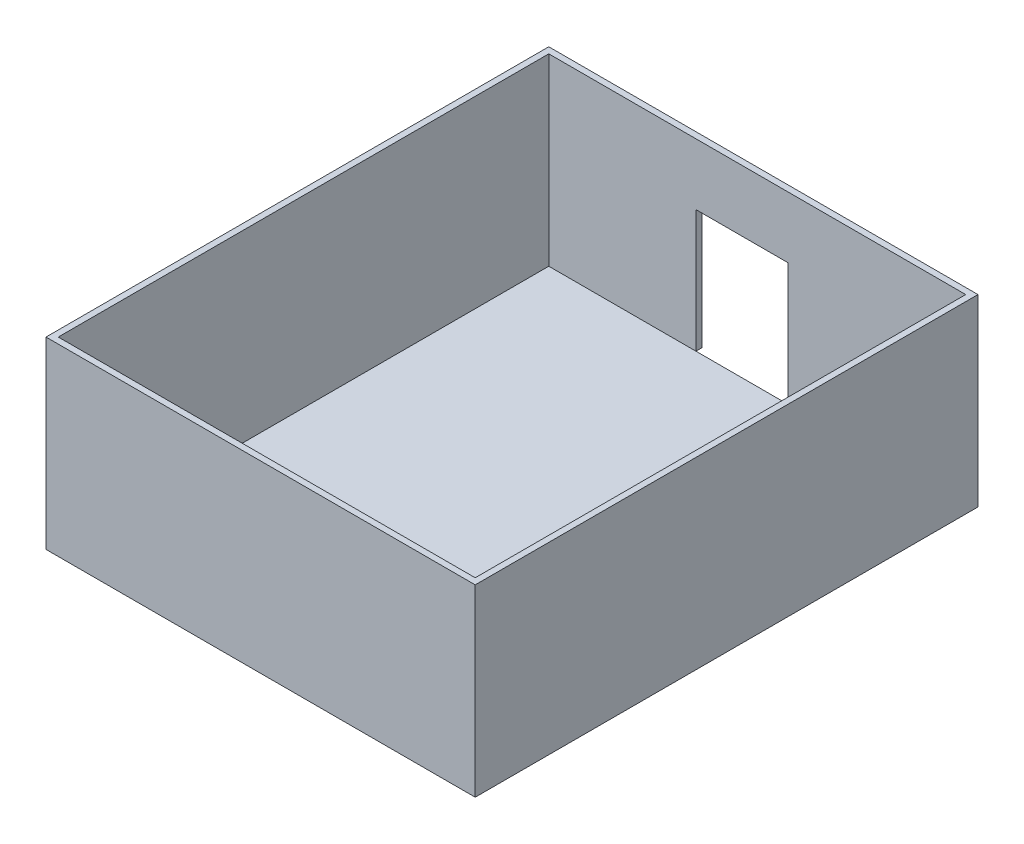
ISO-10303-21;
HEADER;
FILE_DESCRIPTION(('STEP AP214'),'2;1');
FILE_NAME('part.step','',(''),(''),'','','');
FILE_SCHEMA(('AUTOMOTIVE_DESIGN { 1 0 10303 214 1 1 1 1 }'));
ENDSEC;
DATA;
#1=APPLICATION_CONTEXT('core data for automotive mechanical design processes');
#2=APPLICATION_PROTOCOL_DEFINITION('international standard','automotive_design',2000,#1);
#3=PRODUCT_CONTEXT('',#1,'mechanical');
#4=PRODUCT('Part','Part','',(#3));
#5=PRODUCT_RELATED_PRODUCT_CATEGORY('part','',(#4));
#6=PRODUCT_DEFINITION_FORMATION('','',#4);
#7=PRODUCT_DEFINITION_CONTEXT('part definition',#1,'design');
#8=PRODUCT_DEFINITION('design','',#6,#7);
#9=PRODUCT_DEFINITION_SHAPE('','',#8);
#10=(LENGTH_UNIT() NAMED_UNIT(*) SI_UNIT(.MILLI.,.METRE.));
#11=(NAMED_UNIT(*) PLANE_ANGLE_UNIT() SI_UNIT($,.RADIAN.));
#12=(NAMED_UNIT(*) SI_UNIT($,.STERADIAN.) SOLID_ANGLE_UNIT());
#13=UNCERTAINTY_MEASURE_WITH_UNIT(LENGTH_MEASURE(1.E-05),#10,'distance_accuracy_value','');
#14=(GEOMETRIC_REPRESENTATION_CONTEXT(3) GLOBAL_UNCERTAINTY_ASSIGNED_CONTEXT((#13)) GLOBAL_UNIT_ASSIGNED_CONTEXT((#10,
#11,#12)) REPRESENTATION_CONTEXT('',''));
#15=CARTESIAN_POINT('',(0.,0.,0.));
#16=DIRECTION('',(0.,0.,1.));
#17=DIRECTION('',(1.,0.,0.));
#18=AXIS2_PLACEMENT_3D('',#15,#16,#17);
#19=CARTESIAN_POINT('',(0.,3010.,0.));
#20=DIRECTION('',(0.,1.,0.));
#21=DIRECTION('',(0.,0.,1.));
#22=AXIS2_PLACEMENT_3D('',#19,#20,#21);
#23=PLANE('',#22);
#24=DIRECTION('',(1.,0.,0.));
#25=VECTOR('',#24,1.);
#26=CARTESIAN_POINT('',(-6900.,3010.,99.9999999999999));
#27=LINE('',#26,#25);
#28=CARTESIAN_POINT('',(-6900.,3010.,99.9999999999999));
#29=VERTEX_POINT('',#28);
#30=CARTESIAN_POINT('',(100.,3010.,100.));
#31=VERTEX_POINT('',#30);
#32=EDGE_CURVE('E295',#29,#31,#27,.T.);
#33=ORIENTED_EDGE('',*,*,#32,.T.);
#34=DIRECTION('',(0.,0.,-1.));
#35=VECTOR('',#34,1.);
#36=CARTESIAN_POINT('',(100.,3010.,100.));
#37=LINE('',#36,#35);
#38=CARTESIAN_POINT('',(100.,3010.,-8100.));
#39=VERTEX_POINT('',#38);
#40=EDGE_CURVE('E299',#31,#39,#37,.T.);
#41=ORIENTED_EDGE('',*,*,#40,.T.);
#42=DIRECTION('',(-1.,0.,0.));
#43=VECTOR('',#42,1.);
#44=CARTESIAN_POINT('',(100.,3010.,-8100.));
#45=LINE('',#44,#43);
#46=CARTESIAN_POINT('',(-6900.,3010.,-8100.));
#47=VERTEX_POINT('',#46);
#48=EDGE_CURVE('E303',#39,#47,#45,.T.);
#49=ORIENTED_EDGE('',*,*,#48,.T.);
#50=DIRECTION('',(0.,0.,1.));
#51=VECTOR('',#50,1.);
#52=CARTESIAN_POINT('',(-6900.,3010.,-8100.));
#53=LINE('',#52,#51);
#54=EDGE_CURVE('E306',#47,#29,#53,.T.);
#55=ORIENTED_EDGE('',*,*,#54,.T.);
#56=EDGE_LOOP('',(#33,#41,#49,#55));
#57=FACE_BOUND('',#56,.T.);
#58=DIRECTION('',(0.,0.,-1.));
#59=VECTOR('',#58,1.);
#60=CARTESIAN_POINT('',(0.,3010.,0.));
#61=LINE('',#60,#59);
#62=CARTESIAN_POINT('',(0.,3010.,0.));
#63=VERTEX_POINT('',#62);
#64=CARTESIAN_POINT('',(3.90278794648645E-13,3010.,-8000.));
#65=VERTEX_POINT('',#64);
#66=EDGE_CURVE('E251',#63,#65,#61,.T.);
#67=ORIENTED_EDGE('',*,*,#66,.F.);
#68=DIRECTION('',(1.,0.,0.));
#69=VECTOR('',#68,1.);
#70=CARTESIAN_POINT('',(-6800.,3010.,9.79717439317883E-13));
#71=LINE('',#70,#69);
#72=CARTESIAN_POINT('',(-6800.,3010.,9.79717439317883E-13));
#73=VERTEX_POINT('',#72);
#74=EDGE_CURVE('E248',#73,#63,#71,.T.);
#75=ORIENTED_EDGE('',*,*,#74,.F.);
#76=DIRECTION('',(0.,0.,1.));
#77=VECTOR('',#76,1.);
#78=CARTESIAN_POINT('',(-6800.,3010.,-8000.));
#79=LINE('',#78,#77);
#80=CARTESIAN_POINT('',(-6800.,3010.,-8000.));
#81=VERTEX_POINT('',#80);
#82=EDGE_CURVE('E259',#81,#73,#79,.T.);
#83=ORIENTED_EDGE('',*,*,#82,.F.);
#84=DIRECTION('',(-1.,0.,0.));
#85=VECTOR('',#84,1.);
#86=CARTESIAN_POINT('',(3.90278794648645E-13,3010.,-8000.));
#87=LINE('',#86,#85);
#88=EDGE_CURVE('E255',#65,#81,#87,.T.);
#89=ORIENTED_EDGE('',*,*,#88,.F.);
#90=EDGE_LOOP('',(#67,#75,#83,#89));
#91=FACE_BOUND('',#90,.T.);
#92=ADVANCED_FACE('F53',(#57,#91),#23,.T.);
#93=CARTESIAN_POINT('',(0.,10.,0.));
#94=DIRECTION('',(0.,1.,0.));
#95=DIRECTION('',(0.,0.,1.));
#96=AXIS2_PLACEMENT_3D('',#93,#94,#95);
#97=PLANE('',#96);
#98=DIRECTION('',(0.,0.,-1.));
#99=VECTOR('',#98,1.);
#100=CARTESIAN_POINT('',(0.,10.,0.));
#101=LINE('',#100,#99);
#102=CARTESIAN_POINT('',(0.,10.,0.));
#103=VERTEX_POINT('',#102);
#104=CARTESIAN_POINT('',(0.,10.,-1400.));
#105=VERTEX_POINT('',#104);
#106=EDGE_CURVE('E267',#103,#105,#101,.T.);
#107=ORIENTED_EDGE('',*,*,#106,.T.);
#108=DIRECTION('',(-1.,0.,0.));
#109=VECTOR('',#108,1.);
#110=CARTESIAN_POINT('',(10.0000000000001,10.,-1400.));
#111=LINE('',#110,#109);
#112=CARTESIAN_POINT('',(10.0000000000001,10.,-1400.));
#113=VERTEX_POINT('',#112);
#114=EDGE_CURVE('E204',#113,#105,#111,.T.);
#115=ORIENTED_EDGE('',*,*,#114,.F.);
#116=DIRECTION('',(0.,0.,1.));
#117=VECTOR('',#116,1.);
#118=CARTESIAN_POINT('',(10.0000000000001,10.,-1400.));
#119=LINE('',#118,#117);
#120=CARTESIAN_POINT('',(10.0000000000001,9.9999999999999,-2200.));
#121=VERTEX_POINT('',#120);
#122=EDGE_CURVE('E175',#121,#113,#119,.T.);
#123=ORIENTED_EDGE('',*,*,#122,.F.);
#124=DIRECTION('',(-1.,0.,0.));
#125=VECTOR('',#124,1.);
#126=CARTESIAN_POINT('',(10.0000000000001,9.9999999999999,-2200.));
#127=LINE('',#126,#125);
#128=CARTESIAN_POINT('',(1.07326668528377E-13,9.9999999999999,-2200.));
#129=VERTEX_POINT('',#128);
#130=EDGE_CURVE('E208',#121,#129,#127,.T.);
#131=ORIENTED_EDGE('',*,*,#130,.T.);
#132=CARTESIAN_POINT('',(3.90278794648645E-13,10.,-8000.));
#133=VERTEX_POINT('',#132);
#134=EDGE_CURVE('E266',#129,#133,#101,.T.);
#135=ORIENTED_EDGE('',*,*,#134,.T.);
#136=DIRECTION('',(-1.,0.,0.));
#137=VECTOR('',#136,1.);
#138=CARTESIAN_POINT('',(3.90278794648645E-13,10.,-8000.));
#139=LINE('',#138,#137);
#140=CARTESIAN_POINT('',(-2900.,10.0000000000001,-8000.));
#141=VERTEX_POINT('',#140);
#142=EDGE_CURVE('E272',#133,#141,#139,.T.);
#143=ORIENTED_EDGE('',*,*,#142,.T.);
#144=DIRECTION('',(0.,0.,-1.));
#145=VECTOR('',#144,1.);
#146=CARTESIAN_POINT('',(-2900.,10.0000000000001,-8000.));
#147=LINE('',#146,#145);
#148=CARTESIAN_POINT('',(-2900.,10.0000000000001,-8100.));
#149=VERTEX_POINT('',#148);
#150=EDGE_CURVE('E239',#141,#149,#147,.T.);
#151=ORIENTED_EDGE('',*,*,#150,.T.);
#152=DIRECTION('',(-1.,0.,0.));
#153=VECTOR('',#152,1.);
#154=CARTESIAN_POINT('',(100.,10.,-8100.));
#155=LINE('',#154,#153);
#156=CARTESIAN_POINT('',(100.,10.,-8100.));
#157=VERTEX_POINT('',#156);
#158=EDGE_CURVE('E317',#157,#149,#155,.T.);
#159=ORIENTED_EDGE('',*,*,#158,.F.);
#160=DIRECTION('',(0.,0.,-1.));
#161=VECTOR('',#160,1.);
#162=CARTESIAN_POINT('',(100.,10.,100.));
#163=LINE('',#162,#161);
#164=CARTESIAN_POINT('',(100.,10.,100.));
#165=VERTEX_POINT('',#164);
#166=EDGE_CURVE('E313',#165,#157,#163,.T.);
#167=ORIENTED_EDGE('',*,*,#166,.F.);
#168=DIRECTION('',(1.,0.,0.));
#169=VECTOR('',#168,1.);
#170=CARTESIAN_POINT('',(-6900.,10.,99.9999999999999));
#171=LINE('',#170,#169);
#172=CARTESIAN_POINT('',(-6900.,10.,99.9999999999999));
#173=VERTEX_POINT('',#172);
#174=EDGE_CURVE('E294',#173,#165,#171,.T.);
#175=ORIENTED_EDGE('',*,*,#174,.F.);
#176=DIRECTION('',(0.,0.,1.));
#177=VECTOR('',#176,1.);
#178=CARTESIAN_POINT('',(-6900.,10.,-8100.));
#179=LINE('',#178,#177);
#180=CARTESIAN_POINT('',(-6900.,10.,-8100.));
#181=VERTEX_POINT('',#180);
#182=EDGE_CURVE('E300',#181,#173,#179,.T.);
#183=ORIENTED_EDGE('',*,*,#182,.F.);
#184=CARTESIAN_POINT('',(-4400.,10.,-8100.));
#185=VERTEX_POINT('',#184);
#186=EDGE_CURVE('E316',#185,#181,#155,.T.);
#187=ORIENTED_EDGE('',*,*,#186,.F.);
#188=DIRECTION('',(0.,0.,-1.));
#189=VECTOR('',#188,1.);
#190=CARTESIAN_POINT('',(-4400.,10.,-8000.));
#191=LINE('',#190,#189);
#192=CARTESIAN_POINT('',(-4400.,10.,-8000.));
#193=VERTEX_POINT('',#192);
#194=EDGE_CURVE('E235',#193,#185,#191,.T.);
#195=ORIENTED_EDGE('',*,*,#194,.F.);
#196=CARTESIAN_POINT('',(-6800.,10.,-8000.));
#197=VERTEX_POINT('',#196);
#198=EDGE_CURVE('E271',#193,#197,#139,.T.);
#199=ORIENTED_EDGE('',*,*,#198,.T.);
#200=DIRECTION('',(0.,0.,1.));
#201=VECTOR('',#200,1.);
#202=CARTESIAN_POINT('',(-6800.,10.,-8000.));
#203=LINE('',#202,#201);
#204=CARTESIAN_POINT('',(-6800.,10.,9.79717443686954E-13));
#205=VERTEX_POINT('',#204);
#206=EDGE_CURVE('E252',#197,#205,#203,.T.);
#207=ORIENTED_EDGE('',*,*,#206,.T.);
#208=DIRECTION('',(1.,0.,0.));
#209=VECTOR('',#208,1.);
#210=CARTESIAN_POINT('',(-6800.,10.,9.79717439317883E-13));
#211=LINE('',#210,#209);
#212=EDGE_CURVE('E238',#205,#103,#211,.T.);
#213=ORIENTED_EDGE('',*,*,#212,.T.);
#214=EDGE_LOOP('',(#107,#115,#123,#131,#135,#143,#151,#159,#167,#175,#183,#187,#195,#199,#207,#213));
#215=FACE_BOUND('',#214,.T.);
#216=ADVANCED_FACE('F341',(#215),#97,.F.);
#217=CARTESIAN_POINT('',(-6900.,3010.,99.9999999999999));
#218=DIRECTION('',(0.,0.,-1.));
#219=DIRECTION('',(-1.,0.,0.));
#220=AXIS2_PLACEMENT_3D('',#217,#218,#219);
#221=PLANE('',#220);
#222=ORIENTED_EDGE('',*,*,#174,.T.);
#223=DIRECTION('',(0.,-1.,0.));
#224=VECTOR('',#223,1.);
#225=CARTESIAN_POINT('',(100.,3010.,100.));
#226=LINE('',#225,#224);
#227=EDGE_CURVE('E12',#31,#165,#226,.T.);
#228=ORIENTED_EDGE('',*,*,#227,.F.);
#229=ORIENTED_EDGE('',*,*,#32,.F.);
#230=DIRECTION('',(0.,-1.,0.));
#231=VECTOR('',#230,1.);
#232=CARTESIAN_POINT('',(-6900.,3010.,99.9999999999999));
#233=LINE('',#232,#231);
#234=EDGE_CURVE('E309',#29,#173,#233,.T.);
#235=ORIENTED_EDGE('',*,*,#234,.T.);
#236=EDGE_LOOP('',(#222,#228,#229,#235));
#237=FACE_BOUND('',#236,.T.);
#238=ADVANCED_FACE('F55',(#237),#221,.F.);
#239=CARTESIAN_POINT('',(100.,3010.,100.));
#240=DIRECTION('',(-1.,0.,0.));
#241=DIRECTION('',(0.,0.,1.));
#242=AXIS2_PLACEMENT_3D('',#239,#240,#241);
#243=PLANE('',#242);
#244=ORIENTED_EDGE('',*,*,#166,.T.);
#245=DIRECTION('',(0.,-1.,0.));
#246=VECTOR('',#245,1.);
#247=CARTESIAN_POINT('',(100.,3010.,-8100.));
#248=LINE('',#247,#246);
#249=EDGE_CURVE('E62',#39,#157,#248,.T.);
#250=ORIENTED_EDGE('',*,*,#249,.F.);
#251=ORIENTED_EDGE('',*,*,#40,.F.);
#252=ORIENTED_EDGE('',*,*,#227,.T.);
#253=EDGE_LOOP('',(#244,#250,#251,#252));
#254=FACE_BOUND('',#253,.T.);
#255=ADVANCED_FACE('F402',(#254),#243,.F.);
#256=CARTESIAN_POINT('',(100.,3010.,-8100.));
#257=DIRECTION('',(0.,0.,1.));
#258=DIRECTION('',(1.,0.,0.));
#259=AXIS2_PLACEMENT_3D('',#256,#257,#258);
#260=PLANE('',#259);
#261=DIRECTION('',(1.,0.,0.));
#262=VECTOR('',#261,1.);
#263=CARTESIAN_POINT('',(-4400.,2010.,-8100.));
#264=LINE('',#263,#262);
#265=CARTESIAN_POINT('',(-4400.,2010.,-8100.));
#266=VERTEX_POINT('',#265);
#267=CARTESIAN_POINT('',(-2900.,2010.,-8100.));
#268=VERTEX_POINT('',#267);
#269=EDGE_CURVE('E229',#266,#268,#264,.T.);
#270=ORIENTED_EDGE('',*,*,#269,.F.);
#271=DIRECTION('',(0.,1.,0.));
#272=VECTOR('',#271,1.);
#273=CARTESIAN_POINT('',(-4400.,10.,-8100.));
#274=LINE('',#273,#272);
#275=EDGE_CURVE('E207',#185,#266,#274,.T.);
#276=ORIENTED_EDGE('',*,*,#275,.F.);
#277=ORIENTED_EDGE('',*,*,#186,.T.);
#278=DIRECTION('',(0.,-1.,0.));
#279=VECTOR('',#278,1.);
#280=CARTESIAN_POINT('',(-6900.,3010.,-8100.));
#281=LINE('',#280,#279);
#282=EDGE_CURVE('E326',#47,#181,#281,.T.);
#283=ORIENTED_EDGE('',*,*,#282,.F.);
#284=ORIENTED_EDGE('',*,*,#48,.F.);
#285=ORIENTED_EDGE('',*,*,#249,.T.);
#286=ORIENTED_EDGE('',*,*,#158,.T.);
#287=DIRECTION('',(0.,-1.,0.));
#288=VECTOR('',#287,1.);
#289=CARTESIAN_POINT('',(-2900.,10.0000000000001,-8100.));
#290=LINE('',#289,#288);
#291=EDGE_CURVE('E219',#268,#149,#290,.T.);
#292=ORIENTED_EDGE('',*,*,#291,.F.);
#293=EDGE_LOOP('',(#270,#276,#277,#283,#284,#285,#286,#292));
#294=FACE_BOUND('',#293,.T.);
#295=ADVANCED_FACE('F336',(#294),#260,.F.);
#296=CARTESIAN_POINT('',(-6900.,3010.,-8100.));
#297=DIRECTION('',(1.,0.,0.));
#298=DIRECTION('',(0.,0.,-1.));
#299=AXIS2_PLACEMENT_3D('',#296,#297,#298);
#300=PLANE('',#299);
#301=ORIENTED_EDGE('',*,*,#182,.T.);
#302=ORIENTED_EDGE('',*,*,#234,.F.);
#303=ORIENTED_EDGE('',*,*,#54,.F.);
#304=ORIENTED_EDGE('',*,*,#282,.T.);
#305=EDGE_LOOP('',(#301,#302,#303,#304));
#306=FACE_BOUND('',#305,.T.);
#307=ADVANCED_FACE('F397',(#306),#300,.F.);
#308=CARTESIAN_POINT('',(-6800.,3010.,9.79717439317883E-13));
#309=DIRECTION('',(0.,0.,-1.));
#310=DIRECTION('',(-1.,0.,0.));
#311=AXIS2_PLACEMENT_3D('',#308,#309,#310);
#312=PLANE('',#311);
#313=ORIENTED_EDGE('',*,*,#212,.F.);
#314=DIRECTION('',(0.,-1.,0.));
#315=VECTOR('',#314,1.);
#316=CARTESIAN_POINT('',(-6800.,3010.,9.79717439317883E-13));
#317=LINE('',#316,#315);
#318=EDGE_CURVE('E262',#73,#205,#317,.T.);
#319=ORIENTED_EDGE('',*,*,#318,.F.);
#320=ORIENTED_EDGE('',*,*,#74,.T.);
#321=DIRECTION('',(0.,-1.,0.));
#322=VECTOR('',#321,1.);
#323=CARTESIAN_POINT('',(0.,3010.,0.));
#324=LINE('',#323,#322);
#325=EDGE_CURVE('E290',#63,#103,#324,.T.);
#326=ORIENTED_EDGE('',*,*,#325,.T.);
#327=EDGE_LOOP('',(#313,#319,#320,#326));
#328=FACE_BOUND('',#327,.T.);
#329=ADVANCED_FACE('F375',(#328),#312,.T.);
#330=CARTESIAN_POINT('',(0.,3010.,0.));
#331=DIRECTION('',(-1.,0.,0.));
#332=DIRECTION('',(0.,0.,1.));
#333=AXIS2_PLACEMENT_3D('',#330,#331,#332);
#334=PLANE('',#333);
#335=DIRECTION('',(0.,1.,0.));
#336=VECTOR('',#335,1.);
#337=CARTESIAN_POINT('',(0.,10.,-1400.));
#338=LINE('',#337,#336);
#339=CARTESIAN_POINT('',(0.,2110.,-1400.));
#340=VERTEX_POINT('',#339);
#341=EDGE_CURVE('E69',#105,#340,#338,.T.);
#342=ORIENTED_EDGE('',*,*,#341,.F.);
#343=ORIENTED_EDGE('',*,*,#106,.F.);
#344=ORIENTED_EDGE('',*,*,#325,.F.);
#345=ORIENTED_EDGE('',*,*,#66,.T.);
#346=DIRECTION('',(0.,-1.,0.));
#347=VECTOR('',#346,1.);
#348=CARTESIAN_POINT('',(3.90278794648645E-13,3010.,-8000.));
#349=LINE('',#348,#347);
#350=EDGE_CURVE('E286',#65,#133,#349,.T.);
#351=ORIENTED_EDGE('',*,*,#350,.T.);
#352=ORIENTED_EDGE('',*,*,#134,.F.);
#353=DIRECTION('',(0.,-1.,0.));
#354=VECTOR('',#353,1.);
#355=CARTESIAN_POINT('',(1.07326668528377E-13,9.9999999999999,-2200.));
#356=LINE('',#355,#354);
#357=CARTESIAN_POINT('',(1.07326668528377E-13,2110.,-2200.));
#358=VERTEX_POINT('',#357);
#359=EDGE_CURVE('E190',#358,#129,#356,.T.);
#360=ORIENTED_EDGE('',*,*,#359,.F.);
#361=DIRECTION('',(0.,0.,-1.));
#362=VECTOR('',#361,1.);
#363=CARTESIAN_POINT('',(0.,2110.,-1400.));
#364=LINE('',#363,#362);
#365=EDGE_CURVE('E193',#340,#358,#364,.T.);
#366=ORIENTED_EDGE('',*,*,#365,.F.);
#367=EDGE_LOOP('',(#342,#343,#344,#345,#351,#352,#360,#366));
#368=FACE_BOUND('',#367,.T.);
#369=ADVANCED_FACE('F363',(#368),#334,.T.);
#370=CARTESIAN_POINT('',(3.90278794648645E-13,3010.,-8000.));
#371=DIRECTION('',(0.,0.,1.));
#372=DIRECTION('',(1.,0.,0.));
#373=AXIS2_PLACEMENT_3D('',#370,#371,#372);
#374=PLANE('',#373);
#375=DIRECTION('',(0.,1.,0.));
#376=VECTOR('',#375,1.);
#377=CARTESIAN_POINT('',(-4400.,10.,-8000.));
#378=LINE('',#377,#376);
#379=CARTESIAN_POINT('',(-4400.,2010.,-8000.));
#380=VERTEX_POINT('',#379);
#381=EDGE_CURVE('E214',#193,#380,#378,.T.);
#382=ORIENTED_EDGE('',*,*,#381,.T.);
#383=DIRECTION('',(1.,0.,0.));
#384=VECTOR('',#383,1.);
#385=CARTESIAN_POINT('',(-4400.,2010.,-8000.));
#386=LINE('',#385,#384);
#387=CARTESIAN_POINT('',(-2900.,2010.,-8000.));
#388=VERTEX_POINT('',#387);
#389=EDGE_CURVE('E218',#380,#388,#386,.T.);
#390=ORIENTED_EDGE('',*,*,#389,.T.);
#391=DIRECTION('',(0.,-1.,0.));
#392=VECTOR('',#391,1.);
#393=CARTESIAN_POINT('',(-2900.,10.0000000000001,-8000.));
#394=LINE('',#393,#392);
#395=EDGE_CURVE('E77',#388,#141,#394,.T.);
#396=ORIENTED_EDGE('',*,*,#395,.T.);
#397=ORIENTED_EDGE('',*,*,#142,.F.);
#398=ORIENTED_EDGE('',*,*,#350,.F.);
#399=ORIENTED_EDGE('',*,*,#88,.T.);
#400=DIRECTION('',(0.,-1.,0.));
#401=VECTOR('',#400,1.);
#402=CARTESIAN_POINT('',(-6800.,3010.,-8000.));
#403=LINE('',#402,#401);
#404=EDGE_CURVE('E282',#81,#197,#403,.T.);
#405=ORIENTED_EDGE('',*,*,#404,.T.);
#406=ORIENTED_EDGE('',*,*,#198,.F.);
#407=EDGE_LOOP('',(#382,#390,#396,#397,#398,#399,#405,#406));
#408=FACE_BOUND('',#407,.T.);
#409=ADVANCED_FACE('F346',(#408),#374,.T.);
#410=CARTESIAN_POINT('',(-6800.,3010.,-8000.));
#411=DIRECTION('',(1.,0.,0.));
#412=DIRECTION('',(0.,0.,-1.));
#413=AXIS2_PLACEMENT_3D('',#410,#411,#412);
#414=PLANE('',#413);
#415=ORIENTED_EDGE('',*,*,#206,.F.);
#416=ORIENTED_EDGE('',*,*,#404,.F.);
#417=ORIENTED_EDGE('',*,*,#82,.T.);
#418=ORIENTED_EDGE('',*,*,#318,.T.);
#419=EDGE_LOOP('',(#415,#416,#417,#418));
#420=FACE_BOUND('',#419,.T.);
#421=ADVANCED_FACE('F373',(#420),#414,.T.);
#422=CARTESIAN_POINT('',(-4400.,10.,-8000.));
#423=DIRECTION('',(-1.,0.,0.));
#424=DIRECTION('',(0.,0.,1.));
#425=AXIS2_PLACEMENT_3D('',#422,#423,#424);
#426=PLANE('',#425);
#427=ORIENTED_EDGE('',*,*,#275,.T.);
#428=DIRECTION('',(0.,0.,-1.));
#429=VECTOR('',#428,1.);
#430=CARTESIAN_POINT('',(-4400.,2010.,-8000.));
#431=LINE('',#430,#429);
#432=EDGE_CURVE('E225',#380,#266,#431,.T.);
#433=ORIENTED_EDGE('',*,*,#432,.F.);
#434=ORIENTED_EDGE('',*,*,#381,.F.);
#435=ORIENTED_EDGE('',*,*,#194,.T.);
#436=EDGE_LOOP('',(#427,#433,#434,#435));
#437=FACE_BOUND('',#436,.T.);
#438=ADVANCED_FACE('F482',(#437),#426,.F.);
#439=CARTESIAN_POINT('',(-2900.,10.0000000000001,-8000.));
#440=DIRECTION('',(1.,0.,0.));
#441=DIRECTION('',(0.,0.,-1.));
#442=AXIS2_PLACEMENT_3D('',#439,#440,#441);
#443=PLANE('',#442);
#444=ORIENTED_EDGE('',*,*,#291,.T.);
#445=ORIENTED_EDGE('',*,*,#150,.F.);
#446=ORIENTED_EDGE('',*,*,#395,.F.);
#447=DIRECTION('',(0.,0.,-1.));
#448=VECTOR('',#447,1.);
#449=CARTESIAN_POINT('',(-2900.,2010.,-8000.));
#450=LINE('',#449,#448);
#451=EDGE_CURVE('E243',#388,#268,#450,.T.);
#452=ORIENTED_EDGE('',*,*,#451,.T.);
#453=EDGE_LOOP('',(#444,#445,#446,#452));
#454=FACE_BOUND('',#453,.T.);
#455=ADVANCED_FACE('F344',(#454),#443,.F.);
#456=CARTESIAN_POINT('',(-4400.,2010.,-8000.));
#457=DIRECTION('',(0.,1.,0.));
#458=DIRECTION('',(0.,0.,1.));
#459=AXIS2_PLACEMENT_3D('',#456,#457,#458);
#460=PLANE('',#459);
#461=ORIENTED_EDGE('',*,*,#269,.T.);
#462=ORIENTED_EDGE('',*,*,#451,.F.);
#463=ORIENTED_EDGE('',*,*,#389,.F.);
#464=ORIENTED_EDGE('',*,*,#432,.T.);
#465=EDGE_LOOP('',(#461,#462,#463,#464));
#466=FACE_BOUND('',#465,.T.);
#467=ADVANCED_FACE('F351',(#466),#460,.F.);
#468=CARTESIAN_POINT('',(10.0000000000001,10.,-1400.));
#469=DIRECTION('',(0.,0.,1.));
#470=DIRECTION('',(1.,0.,0.));
#471=AXIS2_PLACEMENT_3D('',#468,#469,#470);
#472=PLANE('',#471);
#473=ORIENTED_EDGE('',*,*,#341,.T.);
#474=DIRECTION('',(-1.,0.,0.));
#475=VECTOR('',#474,1.);
#476=CARTESIAN_POINT('',(10.0000000000001,2110.,-1400.));
#477=LINE('',#476,#475);
#478=CARTESIAN_POINT('',(10.0000000000001,2110.,-1400.));
#479=VERTEX_POINT('',#478);
#480=EDGE_CURVE('E164',#479,#340,#477,.T.);
#481=ORIENTED_EDGE('',*,*,#480,.F.);
#482=DIRECTION('',(0.,1.,0.));
#483=VECTOR('',#482,1.);
#484=CARTESIAN_POINT('',(10.0000000000001,10.,-1400.));
#485=LINE('',#484,#483);
#486=EDGE_CURVE('E168',#113,#479,#485,.T.);
#487=ORIENTED_EDGE('',*,*,#486,.F.);
#488=ORIENTED_EDGE('',*,*,#114,.T.);
#489=EDGE_LOOP('',(#473,#481,#487,#488));
#490=FACE_BOUND('',#489,.T.);
#491=ADVANCED_FACE('F166',(#490),#472,.F.);
#492=CARTESIAN_POINT('',(10.0000000000001,9.9999999999999,-2200.));
#493=DIRECTION('',(0.,0.,-1.));
#494=DIRECTION('',(0.,1.,0.));
#495=AXIS2_PLACEMENT_3D('',#492,#493,#494);
#496=PLANE('',#495);
#497=ORIENTED_EDGE('',*,*,#359,.T.);
#498=ORIENTED_EDGE('',*,*,#130,.F.);
#499=DIRECTION('',(0.,-1.,0.));
#500=VECTOR('',#499,1.);
#501=CARTESIAN_POINT('',(10.0000000000001,9.9999999999999,-2200.));
#502=LINE('',#501,#500);
#503=CARTESIAN_POINT('',(10.0000000000001,2110.,-2200.));
#504=VERTEX_POINT('',#503);
#505=EDGE_CURVE('E184',#504,#121,#502,.T.);
#506=ORIENTED_EDGE('',*,*,#505,.F.);
#507=DIRECTION('',(-1.,0.,0.));
#508=VECTOR('',#507,1.);
#509=CARTESIAN_POINT('',(10.0000000000001,2110.,-2200.));
#510=LINE('',#509,#508);
#511=EDGE_CURVE('E174',#504,#358,#510,.T.);
#512=ORIENTED_EDGE('',*,*,#511,.T.);
#513=EDGE_LOOP('',(#497,#498,#506,#512));
#514=FACE_BOUND('',#513,.T.);
#515=ADVANCED_FACE('F377',(#514),#496,.F.);
#516=CARTESIAN_POINT('',(10.0000000000001,2110.,-1400.));
#517=DIRECTION('',(0.,1.,0.));
#518=DIRECTION('',(0.,0.,1.));
#519=AXIS2_PLACEMENT_3D('',#516,#517,#518);
#520=PLANE('',#519);
#521=ORIENTED_EDGE('',*,*,#365,.T.);
#522=ORIENTED_EDGE('',*,*,#511,.F.);
#523=DIRECTION('',(0.,0.,-1.));
#524=VECTOR('',#523,1.);
#525=CARTESIAN_POINT('',(10.0000000000001,2110.,-1400.));
#526=LINE('',#525,#524);
#527=EDGE_CURVE('E178',#479,#504,#526,.T.);
#528=ORIENTED_EDGE('',*,*,#527,.F.);
#529=ORIENTED_EDGE('',*,*,#480,.T.);
#530=EDGE_LOOP('',(#521,#522,#528,#529));
#531=FACE_BOUND('',#530,.T.);
#532=ADVANCED_FACE('F179',(#531),#520,.F.);
#533=CARTESIAN_POINT('',(10.,0.,0.));
#534=DIRECTION('',(-1.,0.,0.));
#535=DIRECTION('',(0.,0.,1.));
#536=AXIS2_PLACEMENT_3D('',#533,#534,#535);
#537=PLANE('',#536);
#538=ORIENTED_EDGE('',*,*,#486,.T.);
#539=ORIENTED_EDGE('',*,*,#527,.T.);
#540=ORIENTED_EDGE('',*,*,#505,.T.);
#541=ORIENTED_EDGE('',*,*,#122,.T.);
#542=EDGE_LOOP('',(#538,#539,#540,#541));
#543=FACE_BOUND('',#542,.T.);
#544=ADVANCED_FACE('F186',(#543),#537,.T.);
#545=CLOSED_SHELL('',(#92,#216,#238,#255,#295,#307,#329,#369,#409,#421,#438,#455,#467,#491,#515,
#532,#544));
#546=MANIFOLD_SOLID_BREP('B2',#545);
#547=CARTESIAN_POINT('',(0.,10.,0.));
#548=DIRECTION('',(-1.,0.,0.));
#549=DIRECTION('',(0.,0.,1.));
#550=AXIS2_PLACEMENT_3D('',#547,#548,#549);
#551=PLANE('',#550);
#552=DIRECTION('',(0.,0.,-1.));
#553=VECTOR('',#552,1.);
#554=CARTESIAN_POINT('',(0.,0.,0.));
#555=LINE('',#554,#553);
#556=CARTESIAN_POINT('',(0.,0.,0.));
#557=VERTEX_POINT('',#556);
#558=CARTESIAN_POINT('',(3.90278794648645E-13,0.,-8000.));
#559=VERTEX_POINT('',#558);
#560=EDGE_CURVE('E622',#557,#559,#555,.T.);
#561=ORIENTED_EDGE('',*,*,#560,.T.);
#562=DIRECTION('',(0.,-1.,0.));
#563=VECTOR('',#562,1.);
#564=CARTESIAN_POINT('',(3.90278794648645E-13,10.,-8000.));
#565=LINE('',#564,#563);
#566=CARTESIAN_POINT('',(3.90278794648645E-13,10.,-8000.));
#567=VERTEX_POINT('',#566);
#568=EDGE_CURVE('E51',#567,#559,#565,.T.);
#569=ORIENTED_EDGE('',*,*,#568,.F.);
#570=DIRECTION('',(0.,0.,-1.));
#571=VECTOR('',#570,1.);
#572=CARTESIAN_POINT('',(0.,10.,0.));
#573=LINE('',#572,#571);
#574=CARTESIAN_POINT('',(0.,10.,0.));
#575=VERTEX_POINT('',#574);
#576=EDGE_CURVE('E603',#575,#567,#573,.T.);
#577=ORIENTED_EDGE('',*,*,#576,.F.);
#578=DIRECTION('',(0.,-1.,0.));
#579=VECTOR('',#578,1.);
#580=CARTESIAN_POINT('',(0.,10.,0.));
#581=LINE('',#580,#579);
#582=EDGE_CURVE('E618',#575,#557,#581,.T.);
#583=ORIENTED_EDGE('',*,*,#582,.T.);
#584=EDGE_LOOP('',(#561,#569,#577,#583));
#585=FACE_BOUND('',#584,.T.);
#586=ADVANCED_FACE('F559',(#585),#551,.F.);
#587=CARTESIAN_POINT('',(3.90278794648645E-13,10.,-8000.));
#588=DIRECTION('',(0.,0.,1.));
#589=DIRECTION('',(1.,0.,0.));
#590=AXIS2_PLACEMENT_3D('',#587,#588,#589);
#591=PLANE('',#590);
#592=DIRECTION('',(-1.,0.,0.));
#593=VECTOR('',#592,1.);
#594=CARTESIAN_POINT('',(3.90278794648645E-13,0.,-8000.));
#595=LINE('',#594,#593);
#596=CARTESIAN_POINT('',(-6800.,0.,-8000.));
#597=VERTEX_POINT('',#596);
#598=EDGE_CURVE('E614',#559,#597,#595,.T.);
#599=ORIENTED_EDGE('',*,*,#598,.T.);
#600=DIRECTION('',(0.,-1.,0.));
#601=VECTOR('',#600,1.);
#602=CARTESIAN_POINT('',(-6800.,10.,-8000.));
#603=LINE('',#602,#601);
#604=CARTESIAN_POINT('',(-6800.,10.,-8000.));
#605=VERTEX_POINT('',#604);
#606=EDGE_CURVE('E567',#605,#597,#603,.T.);
#607=ORIENTED_EDGE('',*,*,#606,.F.);
#608=DIRECTION('',(-1.,0.,0.));
#609=VECTOR('',#608,1.);
#610=CARTESIAN_POINT('',(3.90278794648645E-13,10.,-8000.));
#611=LINE('',#610,#609);
#612=EDGE_CURVE('E605',#567,#605,#611,.T.);
#613=ORIENTED_EDGE('',*,*,#612,.F.);
#614=ORIENTED_EDGE('',*,*,#568,.T.);
#615=EDGE_LOOP('',(#599,#607,#613,#614));
#616=FACE_BOUND('',#615,.T.);
#617=ADVANCED_FACE('F613',(#616),#591,.F.);
#618=CARTESIAN_POINT('',(-6800.,10.,9.79717439317883E-13));
#619=DIRECTION('',(1.,0.,0.));
#620=DIRECTION('',(0.,0.,-1.));
#621=AXIS2_PLACEMENT_3D('',#618,#619,#620);
#622=PLANE('',#621);
#623=DIRECTION('',(0.,0.,1.));
#624=VECTOR('',#623,1.);
#625=CARTESIAN_POINT('',(-6800.,0.,9.79717439317883E-13));
#626=LINE('',#625,#624);
#627=CARTESIAN_POINT('',(-6800.,0.,9.79717439317883E-13));
#628=VERTEX_POINT('',#627);
#629=EDGE_CURVE('E592',#597,#628,#626,.T.);
#630=ORIENTED_EDGE('',*,*,#629,.T.);
#631=DIRECTION('',(0.,-1.,0.));
#632=VECTOR('',#631,1.);
#633=CARTESIAN_POINT('',(-6800.,10.,9.79717439317883E-13));
#634=LINE('',#633,#632);
#635=CARTESIAN_POINT('',(-6800.,10.,9.79717439317883E-13));
#636=VERTEX_POINT('',#635);
#637=EDGE_CURVE('E615',#636,#628,#634,.T.);
#638=ORIENTED_EDGE('',*,*,#637,.F.);
#639=DIRECTION('',(0.,0.,1.));
#640=VECTOR('',#639,1.);
#641=CARTESIAN_POINT('',(-6800.,10.,9.79717439317883E-13));
#642=LINE('',#641,#640);
#643=EDGE_CURVE('E609',#605,#636,#642,.T.);
#644=ORIENTED_EDGE('',*,*,#643,.F.);
#645=ORIENTED_EDGE('',*,*,#606,.T.);
#646=EDGE_LOOP('',(#630,#638,#644,#645));
#647=FACE_BOUND('',#646,.T.);
#648=ADVANCED_FACE('F616',(#647),#622,.F.);
#649=CARTESIAN_POINT('',(0.,10.,0.));
#650=DIRECTION('',(0.,0.,-1.));
#651=DIRECTION('',(-1.,0.,0.));
#652=AXIS2_PLACEMENT_3D('',#649,#650,#651);
#653=PLANE('',#652);
#654=DIRECTION('',(1.,0.,0.));
#655=VECTOR('',#654,1.);
#656=CARTESIAN_POINT('',(0.,0.,0.));
#657=LINE('',#656,#655);
#658=EDGE_CURVE('E598',#628,#557,#657,.T.);
#659=ORIENTED_EDGE('',*,*,#658,.T.);
#660=ORIENTED_EDGE('',*,*,#582,.F.);
#661=DIRECTION('',(1.,0.,0.));
#662=VECTOR('',#661,1.);
#663=CARTESIAN_POINT('',(0.,10.,0.));
#664=LINE('',#663,#662);
#665=EDGE_CURVE('E575',#636,#575,#664,.T.);
#666=ORIENTED_EDGE('',*,*,#665,.F.);
#667=ORIENTED_EDGE('',*,*,#637,.T.);
#668=EDGE_LOOP('',(#659,#660,#666,#667));
#669=FACE_BOUND('',#668,.T.);
#670=ADVANCED_FACE('F629',(#669),#653,.F.);
#671=CARTESIAN_POINT('',(0.,10.,0.));
#672=DIRECTION('',(0.,1.,0.));
#673=DIRECTION('',(0.,0.,1.));
#674=AXIS2_PLACEMENT_3D('',#671,#672,#673);
#675=PLANE('',#674);
#676=ORIENTED_EDGE('',*,*,#576,.T.);
#677=ORIENTED_EDGE('',*,*,#612,.T.);
#678=ORIENTED_EDGE('',*,*,#643,.T.);
#679=ORIENTED_EDGE('',*,*,#665,.T.);
#680=EDGE_LOOP('',(#676,#677,#678,#679));
#681=FACE_BOUND('',#680,.T.);
#682=ADVANCED_FACE('F607',(#681),#675,.T.);
#683=CARTESIAN_POINT('',(0.,0.,0.));
#684=DIRECTION('',(0.,1.,0.));
#685=DIRECTION('',(0.,0.,1.));
#686=AXIS2_PLACEMENT_3D('',#683,#684,#685);
#687=PLANE('',#686);
#688=ORIENTED_EDGE('',*,*,#560,.F.);
#689=ORIENTED_EDGE('',*,*,#658,.F.);
#690=ORIENTED_EDGE('',*,*,#629,.F.);
#691=ORIENTED_EDGE('',*,*,#598,.F.);
#692=EDGE_LOOP('',(#688,#689,#690,#691));
#693=FACE_BOUND('',#692,.T.);
#694=ADVANCED_FACE('F632',(#693),#687,.F.);
#695=CLOSED_SHELL('',(#586,#617,#648,#670,#682,#694));
#696=MANIFOLD_SOLID_BREP('B6',#695);
#697=ADVANCED_BREP_SHAPE_REPRESENTATION('',(#18,#546,#696),#14);
#698=SHAPE_DEFINITION_REPRESENTATION(#9,#697);
ENDSEC;
END-ISO-10303-21;
